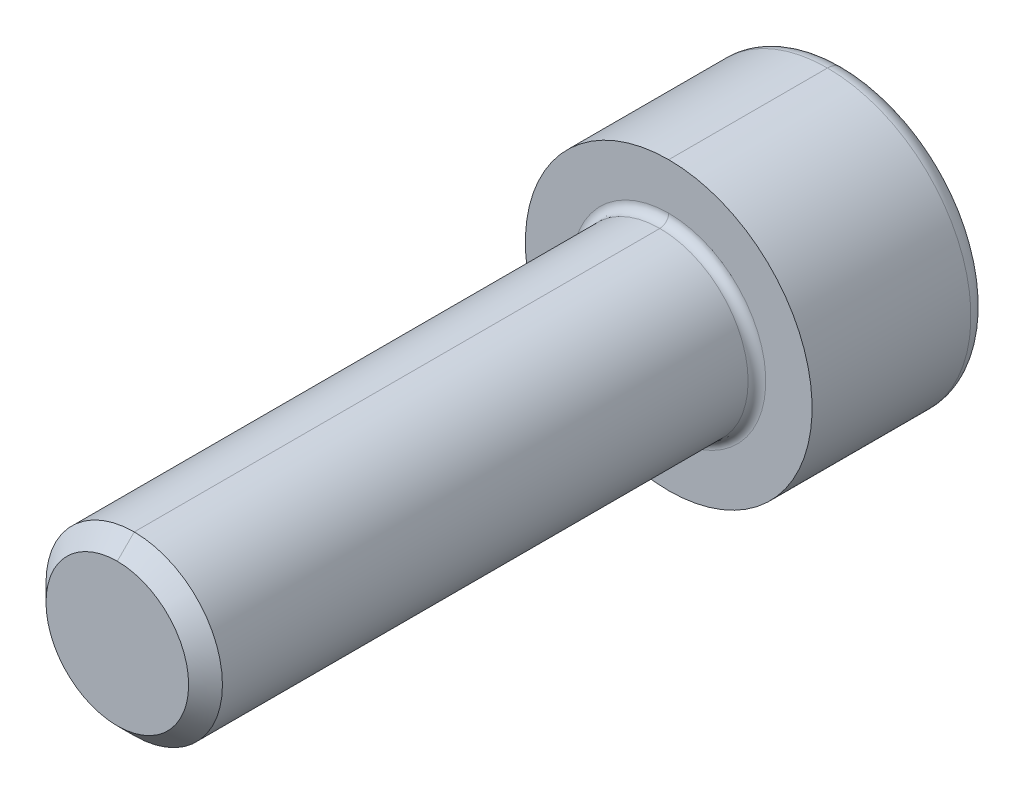
ISO-10303-21;
HEADER;
FILE_DESCRIPTION(('STEP AP214'),'2;1');
FILE_NAME('part.step','',(''),(''),'','','');
FILE_SCHEMA(('AUTOMOTIVE_DESIGN { 1 0 10303 214 1 1 1 1 }'));
ENDSEC;
DATA;
#1=APPLICATION_CONTEXT('core data for automotive mechanical design processes');
#2=APPLICATION_PROTOCOL_DEFINITION('international standard','automotive_design',2000,#1);
#3=PRODUCT_CONTEXT('',#1,'mechanical');
#4=PRODUCT('Part','Part','',(#3));
#5=PRODUCT_RELATED_PRODUCT_CATEGORY('part','',(#4));
#6=PRODUCT_DEFINITION_FORMATION('','',#4);
#7=PRODUCT_DEFINITION_CONTEXT('part definition',#1,'design');
#8=PRODUCT_DEFINITION('design','',#6,#7);
#9=PRODUCT_DEFINITION_SHAPE('','',#8);
#10=(LENGTH_UNIT() NAMED_UNIT(*) SI_UNIT(.MILLI.,.METRE.));
#11=(NAMED_UNIT(*) PLANE_ANGLE_UNIT() SI_UNIT($,.RADIAN.));
#12=(NAMED_UNIT(*) SI_UNIT($,.STERADIAN.) SOLID_ANGLE_UNIT());
#13=UNCERTAINTY_MEASURE_WITH_UNIT(LENGTH_MEASURE(1.E-05),#10,'distance_accuracy_value','');
#14=(GEOMETRIC_REPRESENTATION_CONTEXT(3) GLOBAL_UNCERTAINTY_ASSIGNED_CONTEXT((#13)) GLOBAL_UNIT_ASSIGNED_CONTEXT((#10,
#11,#12)) REPRESENTATION_CONTEXT('',''));
#15=CARTESIAN_POINT('',(0.,0.,0.));
#16=DIRECTION('',(0.,0.,1.));
#17=DIRECTION('',(1.,0.,0.));
#18=AXIS2_PLACEMENT_3D('',#15,#16,#17);
#19=CARTESIAN_POINT('',(1600.,-60.,-1.));
#20=DIRECTION('',(0.,0.,-1.));
#21=DIRECTION('',(0.,-1.,0.));
#22=AXIS2_PLACEMENT_3D('',#19,#20,#21);
#23=PLANE('',#22);
#24=DIRECTION('',(0.,-1.,0.));
#25=VECTOR('',#24,1.);
#26=CARTESIAN_POINT('',(1597.,-59.5669872981,-1.));
#27=LINE('',#26,#25);
#28=CARTESIAN_POINT('',(1597.,-58.2679491924,-1.));
#29=VERTEX_POINT('',#28);
#30=CARTESIAN_POINT('',(1597.,-61.7320508076,-1.));
#31=VERTEX_POINT('',#30);
#32=EDGE_CURVE('E222',#29,#31,#27,.T.);
#33=ORIENTED_EDGE('',*,*,#32,.T.);
#34=DIRECTION('',(0.866025403793048,-0.499999999985088,0.));
#35=VECTOR('',#34,1.);
#36=CARTESIAN_POINT('',(1598.5,-62.5980762113633,-1.));
#37=LINE('',#36,#35);
#38=CARTESIAN_POINT('',(1600.,-63.4641016151,-1.));
#39=VERTEX_POINT('',#38);
#40=EDGE_CURVE('E40',#31,#39,#37,.T.);
#41=ORIENTED_EDGE('',*,*,#40,.T.);
#42=DIRECTION('',(0.866025403793048,0.499999999985088,0.));
#43=VECTOR('',#42,1.);
#44=CARTESIAN_POINT('',(1601.5,-62.5980762113633,-1.));
#45=LINE('',#44,#43);
#46=CARTESIAN_POINT('',(1603.,-61.7320508076,-1.));
#47=VERTEX_POINT('',#46);
#48=EDGE_CURVE('E255',#39,#47,#45,.T.);
#49=ORIENTED_EDGE('',*,*,#48,.T.);
#50=DIRECTION('',(0.,1.,0.));
#51=VECTOR('',#50,1.);
#52=CARTESIAN_POINT('',(1603.,-60.,-1.));
#53=LINE('',#52,#51);
#54=CARTESIAN_POINT('',(1603.,-58.2679491924,-1.));
#55=VERTEX_POINT('',#54);
#56=EDGE_CURVE('E125',#47,#55,#53,.T.);
#57=ORIENTED_EDGE('',*,*,#56,.T.);
#58=DIRECTION('',(-0.866025403793048,0.499999999985088,0.));
#59=VECTOR('',#58,1.);
#60=CARTESIAN_POINT('',(1601.5,-57.4019237886367,-1.));
#61=LINE('',#60,#59);
#62=CARTESIAN_POINT('',(1600.,-56.5358983849,-1.));
#63=VERTEX_POINT('',#62);
#64=EDGE_CURVE('E21',#55,#63,#61,.T.);
#65=ORIENTED_EDGE('',*,*,#64,.T.);
#66=DIRECTION('',(-0.866025403793048,-0.499999999985088,0.));
#67=VECTOR('',#66,1.);
#68=CARTESIAN_POINT('',(1598.5,-57.4019237886367,-1.));
#69=LINE('',#68,#67);
#70=EDGE_CURVE('E197',#63,#29,#69,.T.);
#71=ORIENTED_EDGE('',*,*,#70,.T.);
#72=EDGE_LOOP('',(#33,#41,#49,#57,#65,#71));
#73=FACE_BOUND('',#72,.T.);
#74=CARTESIAN_POINT('',(1600.,-60.,-1.));
#75=DIRECTION('',(0.,0.,-1.));
#76=DIRECTION('',(0.,1.,0.));
#77=AXIS2_PLACEMENT_3D('',#74,#75,#76);
#78=CIRCLE('',#77,5.7);
#79=CARTESIAN_POINT('',(1600.,-54.3,-1.));
#80=VERTEX_POINT('',#79);
#81=CARTESIAN_POINT('',(1600.,-65.7,-1.));
#82=VERTEX_POINT('',#81);
#83=EDGE_CURVE('E27',#80,#82,#78,.T.);
#84=ORIENTED_EDGE('',*,*,#83,.T.);
#85=CARTESIAN_POINT('',(1600.,-60.,-1.));
#86=DIRECTION('',(0.,0.,-1.));
#87=DIRECTION('',(0.,1.,0.));
#88=AXIS2_PLACEMENT_3D('',#85,#86,#87);
#89=CIRCLE('',#88,5.7);
#90=EDGE_CURVE('E189',#82,#80,#89,.T.);
#91=ORIENTED_EDGE('',*,*,#90,.T.);
#92=EDGE_LOOP('',(#84,#91));
#93=FACE_BOUND('',#92,.T.);
#94=ADVANCED_FACE('F17',(#73,#93),#23,.T.);
#95=CARTESIAN_POINT('',(1600.,-60.,7.));
#96=DIRECTION('',(0.,0.,1.));
#97=DIRECTION('',(1.,0.,0.));
#98=AXIS2_PLACEMENT_3D('',#95,#96,#97);
#99=PLANE('',#98);
#100=CARTESIAN_POINT('',(1600.,-60.,7.));
#101=DIRECTION('',(0.,0.,-1.));
#102=DIRECTION('',(0.,1.,0.));
#103=AXIS2_PLACEMENT_3D('',#100,#101,#102);
#104=CIRCLE('',#103,4.4);
#105=CARTESIAN_POINT('',(1600.,-55.6,7.));
#106=VERTEX_POINT('',#105);
#107=CARTESIAN_POINT('',(1600.,-64.4,7.));
#108=VERTEX_POINT('',#107);
#109=EDGE_CURVE('E98',#106,#108,#104,.T.);
#110=ORIENTED_EDGE('',*,*,#109,.T.);
#111=CARTESIAN_POINT('',(1600.,-60.,7.));
#112=DIRECTION('',(0.,0.,-1.));
#113=DIRECTION('',(0.,1.,0.));
#114=AXIS2_PLACEMENT_3D('',#111,#112,#113);
#115=CIRCLE('',#114,4.4);
#116=EDGE_CURVE('E167',#108,#106,#115,.T.);
#117=ORIENTED_EDGE('',*,*,#116,.T.);
#118=EDGE_LOOP('',(#110,#117));
#119=FACE_BOUND('',#118,.T.);
#120=CARTESIAN_POINT('',(1600.,-60.,7.));
#121=DIRECTION('',(0.,0.,1.));
#122=DIRECTION('',(0.,1.,0.));
#123=AXIS2_PLACEMENT_3D('',#120,#121,#122);
#124=CIRCLE('',#123,6.5);
#125=CARTESIAN_POINT('',(1600.,-53.5,7.));
#126=VERTEX_POINT('',#125);
#127=CARTESIAN_POINT('',(1600.,-66.5,7.));
#128=VERTEX_POINT('',#127);
#129=EDGE_CURVE('E11',#126,#128,#124,.T.);
#130=ORIENTED_EDGE('',*,*,#129,.T.);
#131=CARTESIAN_POINT('',(1600.,-60.,7.));
#132=DIRECTION('',(0.,0.,1.));
#133=DIRECTION('',(0.,1.,0.));
#134=AXIS2_PLACEMENT_3D('',#131,#132,#133);
#135=CIRCLE('',#134,6.5);
#136=EDGE_CURVE('E242',#128,#126,#135,.T.);
#137=ORIENTED_EDGE('',*,*,#136,.T.);
#138=EDGE_LOOP('',(#130,#137));
#139=FACE_BOUND('',#138,.T.);
#140=ADVANCED_FACE('F164',(#119,#139),#99,.T.);
#141=CARTESIAN_POINT('',(1600.,-60.,3.));
#142=DIRECTION('',(0.,0.,-1.));
#143=DIRECTION('',(0.,1.,0.));
#144=AXIS2_PLACEMENT_3D('',#141,#142,#143);
#145=CYLINDRICAL_SURFACE('',#144,6.5);
#146=DIRECTION('',(0.,0.,-1.));
#147=VECTOR('',#146,1.);
#148=CARTESIAN_POINT('',(1600.,-53.5,3.));
#149=LINE('',#148,#147);
#150=CARTESIAN_POINT('',(1600.,-53.5,-0.2));
#151=VERTEX_POINT('',#150);
#152=EDGE_CURVE('E243',#126,#151,#149,.T.);
#153=ORIENTED_EDGE('',*,*,#152,.T.);
#154=CARTESIAN_POINT('',(1600.,-60.,-0.2));
#155=DIRECTION('',(0.,0.,1.));
#156=DIRECTION('',(0.,1.,0.));
#157=AXIS2_PLACEMENT_3D('',#154,#155,#156);
#158=CIRCLE('',#157,6.5);
#159=CARTESIAN_POINT('',(1600.,-66.5,-0.2));
#160=VERTEX_POINT('',#159);
#161=EDGE_CURVE('E260',#151,#160,#158,.T.);
#162=ORIENTED_EDGE('',*,*,#161,.T.);
#163=DIRECTION('',(0.,0.,1.));
#164=VECTOR('',#163,1.);
#165=CARTESIAN_POINT('',(1600.,-66.5,3.));
#166=LINE('',#165,#164);
#167=EDGE_CURVE('E237',#160,#128,#166,.T.);
#168=ORIENTED_EDGE('',*,*,#167,.T.);
#169=ORIENTED_EDGE('',*,*,#129,.F.);
#170=EDGE_LOOP('',(#153,#162,#168,#169));
#171=FACE_BOUND('',#170,.T.);
#172=ADVANCED_FACE('F336',(#171),#145,.T.);
#173=CARTESIAN_POINT('',(1600.,-60.,-0.200000000000003));
#174=DIRECTION('',(0.,0.,-1.));
#175=DIRECTION('',(0.,1.,0.));
#176=AXIS2_PLACEMENT_3D('',#173,#174,#175);
#177=TOROIDAL_SURFACE('',#176,5.7,0.8);
#178=CARTESIAN_POINT('',(1600.,-65.7,-0.200000000000003));
#179=DIRECTION('',(1.,0.,0.));
#180=DIRECTION('',(0.,-1.,0.));
#181=AXIS2_PLACEMENT_3D('',#178,#179,#180);
#182=CIRCLE('',#181,0.8);
#183=EDGE_CURVE('E288',#160,#82,#182,.T.);
#184=ORIENTED_EDGE('',*,*,#183,.T.);
#185=ORIENTED_EDGE('',*,*,#83,.F.);
#186=CARTESIAN_POINT('',(1600.,-54.3,-0.200000000000003));
#187=DIRECTION('',(1.,0.,0.));
#188=DIRECTION('',(0.,1.,0.));
#189=AXIS2_PLACEMENT_3D('',#186,#187,#188);
#190=CIRCLE('',#189,0.8);
#191=EDGE_CURVE('E257',#80,#151,#190,.T.);
#192=ORIENTED_EDGE('',*,*,#191,.T.);
#193=CARTESIAN_POINT('',(1600.,-60.,-0.2));
#194=DIRECTION('',(0.,0.,1.));
#195=DIRECTION('',(0.,1.,0.));
#196=AXIS2_PLACEMENT_3D('',#193,#194,#195);
#197=CIRCLE('',#196,6.5);
#198=EDGE_CURVE('E241',#160,#151,#197,.T.);
#199=ORIENTED_EDGE('',*,*,#198,.F.);
#200=EDGE_LOOP('',(#184,#185,#192,#199));
#201=FACE_BOUND('',#200,.T.);
#202=ADVANCED_FACE('F332',(#201),#177,.T.);
#203=CARTESIAN_POINT('',(1600.,-60.,3.));
#204=DIRECTION('',(0.,0.,1.));
#205=DIRECTION('',(1.,0.,0.));
#206=AXIS2_PLACEMENT_3D('',#203,#204,#205);
#207=PLANE('',#206);
#208=DIRECTION('',(0.,1.,0.));
#209=VECTOR('',#208,1.);
#210=CARTESIAN_POINT('',(1597.,-60.,3.));
#211=LINE('',#210,#209);
#212=CARTESIAN_POINT('',(1597.,-61.7320508076,3.));
#213=VERTEX_POINT('',#212);
#214=CARTESIAN_POINT('',(1597.,-58.2679491924,3.));
#215=VERTEX_POINT('',#214);
#216=EDGE_CURVE('E170',#213,#215,#211,.T.);
#217=ORIENTED_EDGE('',*,*,#216,.T.);
#218=DIRECTION('',(0.866025403793048,0.499999999985088,0.));
#219=VECTOR('',#218,1.);
#220=CARTESIAN_POINT('',(1600.,-56.5358983849,3.));
#221=LINE('',#220,#219);
#222=CARTESIAN_POINT('',(1600.,-56.5358983849,3.));
#223=VERTEX_POINT('',#222);
#224=EDGE_CURVE('E200',#215,#223,#221,.T.);
#225=ORIENTED_EDGE('',*,*,#224,.T.);
#226=DIRECTION('',(0.866025403793048,-0.499999999985088,0.));
#227=VECTOR('',#226,1.);
#228=CARTESIAN_POINT('',(1603.,-58.2679491924,3.));
#229=LINE('',#228,#227);
#230=CARTESIAN_POINT('',(1603.,-58.2679491924,3.));
#231=VERTEX_POINT('',#230);
#232=EDGE_CURVE('E207',#223,#231,#229,.T.);
#233=ORIENTED_EDGE('',*,*,#232,.T.);
#234=DIRECTION('',(0.,-1.,0.));
#235=VECTOR('',#234,1.);
#236=CARTESIAN_POINT('',(1603.,-61.7320508076,3.));
#237=LINE('',#236,#235);
#238=CARTESIAN_POINT('',(1603.,-61.7320508076,3.));
#239=VERTEX_POINT('',#238);
#240=EDGE_CURVE('E280',#231,#239,#237,.T.);
#241=ORIENTED_EDGE('',*,*,#240,.T.);
#242=DIRECTION('',(-0.866025403793048,-0.499999999985088,0.));
#243=VECTOR('',#242,1.);
#244=CARTESIAN_POINT('',(1600.,-63.4641016151,3.));
#245=LINE('',#244,#243);
#246=CARTESIAN_POINT('',(1600.,-63.4641016151,3.));
#247=VERTEX_POINT('',#246);
#248=EDGE_CURVE('E136',#239,#247,#245,.T.);
#249=ORIENTED_EDGE('',*,*,#248,.T.);
#250=DIRECTION('',(-0.866025403793048,0.499999999985088,0.));
#251=VECTOR('',#250,1.);
#252=CARTESIAN_POINT('',(1597.,-61.7320508076,3.));
#253=LINE('',#252,#251);
#254=EDGE_CURVE('E52',#247,#213,#253,.T.);
#255=ORIENTED_EDGE('',*,*,#254,.T.);
#256=EDGE_LOOP('',(#217,#225,#233,#241,#249,#255));
#257=FACE_BOUND('',#256,.T.);
#258=ADVANCED_FACE('F310',(#257),#207,.F.);
#259=CARTESIAN_POINT('',(1598.5,-62.59807621135,-1.));
#260=DIRECTION('',(-0.499999999985088,-0.866025403793048,0.));
#261=DIRECTION('',(-0.866025403793048,0.499999999985088,0.));
#262=AXIS2_PLACEMENT_3D('',#259,#260,#261);
#263=PLANE('',#262);
#264=ORIENTED_EDGE('',*,*,#254,.F.);
#265=DIRECTION('',(0.,0.,1.));
#266=VECTOR('',#265,1.);
#267=CARTESIAN_POINT('',(1600.,-63.4641016151,-1.));
#268=LINE('',#267,#266);
#269=EDGE_CURVE('E248',#39,#247,#268,.T.);
#270=ORIENTED_EDGE('',*,*,#269,.F.);
#271=ORIENTED_EDGE('',*,*,#40,.F.);
#272=DIRECTION('',(0.,0.,1.));
#273=VECTOR('',#272,1.);
#274=CARTESIAN_POINT('',(1597.,-61.7320508076,-1.));
#275=LINE('',#274,#273);
#276=EDGE_CURVE('E265',#31,#213,#275,.T.);
#277=ORIENTED_EDGE('',*,*,#276,.T.);
#278=EDGE_LOOP('',(#264,#270,#271,#277));
#279=FACE_BOUND('',#278,.T.);
#280=ADVANCED_FACE('F19',(#279),#263,.F.);
#281=CARTESIAN_POINT('',(1601.5,-62.59807621135,-1.));
#282=DIRECTION('',(0.499999999985088,-0.866025403793048,0.));
#283=DIRECTION('',(0.,0.,-1.));
#284=AXIS2_PLACEMENT_3D('',#281,#282,#283);
#285=PLANE('',#284);
#286=ORIENTED_EDGE('',*,*,#248,.F.);
#287=DIRECTION('',(0.,0.,1.));
#288=VECTOR('',#287,1.);
#289=CARTESIAN_POINT('',(1603.,-61.7320508076,-1.));
#290=LINE('',#289,#288);
#291=EDGE_CURVE('E256',#47,#239,#290,.T.);
#292=ORIENTED_EDGE('',*,*,#291,.F.);
#293=ORIENTED_EDGE('',*,*,#48,.F.);
#294=ORIENTED_EDGE('',*,*,#269,.T.);
#295=EDGE_LOOP('',(#286,#292,#293,#294));
#296=FACE_BOUND('',#295,.T.);
#297=ADVANCED_FACE('F459',(#296),#285,.F.);
#298=CARTESIAN_POINT('',(1603.,-60.,-1.));
#299=DIRECTION('',(1.,0.,0.));
#300=DIRECTION('',(0.,1.,0.));
#301=AXIS2_PLACEMENT_3D('',#298,#299,#300);
#302=PLANE('',#301);
#303=ORIENTED_EDGE('',*,*,#240,.F.);
#304=DIRECTION('',(0.,0.,1.));
#305=VECTOR('',#304,1.);
#306=CARTESIAN_POINT('',(1603.,-58.2679491924,-1.));
#307=LINE('',#306,#305);
#308=EDGE_CURVE('E291',#55,#231,#307,.T.);
#309=ORIENTED_EDGE('',*,*,#308,.F.);
#310=ORIENTED_EDGE('',*,*,#56,.F.);
#311=ORIENTED_EDGE('',*,*,#291,.T.);
#312=EDGE_LOOP('',(#303,#309,#310,#311));
#313=FACE_BOUND('',#312,.T.);
#314=ADVANCED_FACE('F312',(#313),#302,.F.);
#315=CARTESIAN_POINT('',(1601.5,-57.40192378865,-1.));
#316=DIRECTION('',(0.499999999985088,0.866025403793048,0.));
#317=DIRECTION('',(0.,0.,-1.));
#318=AXIS2_PLACEMENT_3D('',#315,#316,#317);
#319=PLANE('',#318);
#320=ORIENTED_EDGE('',*,*,#232,.F.);
#321=DIRECTION('',(0.,0.,1.));
#322=VECTOR('',#321,1.);
#323=CARTESIAN_POINT('',(1600.,-56.5358983849,-1.));
#324=LINE('',#323,#322);
#325=EDGE_CURVE('E199',#63,#223,#324,.T.);
#326=ORIENTED_EDGE('',*,*,#325,.F.);
#327=ORIENTED_EDGE('',*,*,#64,.F.);
#328=ORIENTED_EDGE('',*,*,#308,.T.);
#329=EDGE_LOOP('',(#320,#326,#327,#328));
#330=FACE_BOUND('',#329,.T.);
#331=ADVANCED_FACE('F315',(#330),#319,.F.);
#332=CARTESIAN_POINT('',(1598.5,-57.40192378865,-1.));
#333=DIRECTION('',(-0.499999999985088,0.866025403793048,0.));
#334=DIRECTION('',(0.,0.,1.));
#335=AXIS2_PLACEMENT_3D('',#332,#333,#334);
#336=PLANE('',#335);
#337=ORIENTED_EDGE('',*,*,#224,.F.);
#338=DIRECTION('',(0.,0.,1.));
#339=VECTOR('',#338,1.);
#340=CARTESIAN_POINT('',(1597.,-58.2679491924,-1.));
#341=LINE('',#340,#339);
#342=EDGE_CURVE('E211',#29,#215,#341,.T.);
#343=ORIENTED_EDGE('',*,*,#342,.F.);
#344=ORIENTED_EDGE('',*,*,#70,.F.);
#345=ORIENTED_EDGE('',*,*,#325,.T.);
#346=EDGE_LOOP('',(#337,#343,#344,#345));
#347=FACE_BOUND('',#346,.T.);
#348=ADVANCED_FACE('F410',(#347),#336,.F.);
#349=CARTESIAN_POINT('',(1597.,-59.1339745962,-1.));
#350=DIRECTION('',(-1.,0.,0.));
#351=DIRECTION('',(0.,0.,1.));
#352=AXIS2_PLACEMENT_3D('',#349,#350,#351);
#353=PLANE('',#352);
#354=ORIENTED_EDGE('',*,*,#216,.F.);
#355=ORIENTED_EDGE('',*,*,#276,.F.);
#356=ORIENTED_EDGE('',*,*,#32,.F.);
#357=ORIENTED_EDGE('',*,*,#342,.T.);
#358=EDGE_LOOP('',(#354,#355,#356,#357));
#359=FACE_BOUND('',#358,.T.);
#360=ADVANCED_FACE('F326',(#359),#353,.F.);
#361=CARTESIAN_POINT('',(1600.,-60.,7.4));
#362=DIRECTION('',(0.,0.,1.));
#363=DIRECTION('',(0.,1.,0.));
#364=AXIS2_PLACEMENT_3D('',#361,#362,#363);
#365=TOROIDAL_SURFACE('',#364,4.4,0.4);
#366=CARTESIAN_POINT('',(1600.,-55.6,7.4));
#367=DIRECTION('',(-1.,0.,0.));
#368=DIRECTION('',(0.,1.,0.));
#369=AXIS2_PLACEMENT_3D('',#366,#367,#368);
#370=CIRCLE('',#369,0.4);
#371=CARTESIAN_POINT('',(1600.,-56.,7.4));
#372=VERTEX_POINT('',#371);
#373=EDGE_CURVE('E182',#106,#372,#370,.T.);
#374=ORIENTED_EDGE('',*,*,#373,.T.);
#375=CARTESIAN_POINT('',(1600.,-60.,7.4));
#376=DIRECTION('',(0.,0.,1.));
#377=DIRECTION('',(1.,0.,0.));
#378=AXIS2_PLACEMENT_3D('',#375,#376,#377);
#379=CIRCLE('',#378,4.);
#380=CARTESIAN_POINT('',(1600.,-64.,7.4));
#381=VERTEX_POINT('',#380);
#382=EDGE_CURVE('E160',#381,#372,#379,.T.);
#383=ORIENTED_EDGE('',*,*,#382,.F.);
#384=CARTESIAN_POINT('',(1600.,-64.4,7.4));
#385=DIRECTION('',(-1.,0.,0.));
#386=DIRECTION('',(0.,-1.,0.));
#387=AXIS2_PLACEMENT_3D('',#384,#385,#386);
#388=CIRCLE('',#387,0.4);
#389=EDGE_CURVE('E173',#381,#108,#388,.T.);
#390=ORIENTED_EDGE('',*,*,#389,.T.);
#391=ORIENTED_EDGE('',*,*,#109,.F.);
#392=EDGE_LOOP('',(#374,#383,#390,#391));
#393=FACE_BOUND('',#392,.T.);
#394=ADVANCED_FACE('F174',(#393),#365,.F.);
#395=CARTESIAN_POINT('',(1600.,-60.,32.));
#396=DIRECTION('',(0.,0.,1.));
#397=DIRECTION('',(1.,0.,0.));
#398=AXIS2_PLACEMENT_3D('',#395,#396,#397);
#399=PLANE('',#398);
#400=CARTESIAN_POINT('',(1600.,-60.,32.));
#401=DIRECTION('',(0.,0.,1.));
#402=DIRECTION('',(0.,1.,0.));
#403=AXIS2_PLACEMENT_3D('',#400,#401,#402);
#404=CIRCLE('',#403,3.2332);
#405=CARTESIAN_POINT('',(1600.,-56.7668,32.));
#406=VERTEX_POINT('',#405);
#407=CARTESIAN_POINT('',(1600.,-63.2332,32.));
#408=VERTEX_POINT('',#407);
#409=EDGE_CURVE('E236',#406,#408,#404,.T.);
#410=ORIENTED_EDGE('',*,*,#409,.T.);
#411=CARTESIAN_POINT('',(1600.,-60.,32.));
#412=DIRECTION('',(0.,0.,1.));
#413=DIRECTION('',(0.,1.,0.));
#414=AXIS2_PLACEMENT_3D('',#411,#412,#413);
#415=CIRCLE('',#414,3.2332);
#416=EDGE_CURVE('E196',#408,#406,#415,.T.);
#417=ORIENTED_EDGE('',*,*,#416,.T.);
#418=EDGE_LOOP('',(#410,#417));
#419=FACE_BOUND('',#418,.T.);
#420=ADVANCED_FACE('F325',(#419),#399,.T.);
#421=CARTESIAN_POINT('',(1600.,-60.,19.5));
#422=DIRECTION('',(0.,0.,1.));
#423=DIRECTION('',(0.,1.,0.));
#424=AXIS2_PLACEMENT_3D('',#421,#422,#423);
#425=CYLINDRICAL_SURFACE('',#424,4.);
#426=DIRECTION('',(0.,0.,1.));
#427=VECTOR('',#426,1.);
#428=CARTESIAN_POINT('',(1600.,-56.,19.5));
#429=LINE('',#428,#427);
#430=CARTESIAN_POINT('',(1600.,-56.,31.2332));
#431=VERTEX_POINT('',#430);
#432=EDGE_CURVE('E271',#372,#431,#429,.T.);
#433=ORIENTED_EDGE('',*,*,#432,.T.);
#434=CARTESIAN_POINT('',(1600.,-60.,31.2332));
#435=DIRECTION('',(0.,0.,-1.));
#436=DIRECTION('',(0.,1.,0.));
#437=AXIS2_PLACEMENT_3D('',#434,#435,#436);
#438=CIRCLE('',#437,4.);
#439=CARTESIAN_POINT('',(1600.,-64.,31.2332));
#440=VERTEX_POINT('',#439);
#441=EDGE_CURVE('E195',#431,#440,#438,.T.);
#442=ORIENTED_EDGE('',*,*,#441,.T.);
#443=DIRECTION('',(0.,0.,-1.));
#444=VECTOR('',#443,1.);
#445=CARTESIAN_POINT('',(1600.,-64.,19.5));
#446=LINE('',#445,#444);
#447=EDGE_CURVE('E233',#440,#381,#446,.T.);
#448=ORIENTED_EDGE('',*,*,#447,.T.);
#449=ORIENTED_EDGE('',*,*,#382,.T.);
#450=EDGE_LOOP('',(#433,#442,#448,#449));
#451=FACE_BOUND('',#450,.T.);
#452=ADVANCED_FACE('F344',(#451),#425,.T.);
#453=CARTESIAN_POINT('',(1600.,-60.,31.6166));
#454=DIRECTION('',(0.,0.,-1.));
#455=DIRECTION('',(0.,1.,0.));
#456=AXIS2_PLACEMENT_3D('',#453,#454,#455);
#457=CONICAL_SURFACE('',#456,3.6166,0.785398163397448);
#458=DIRECTION('',(0.,-0.707106781186547,0.707106781186548));
#459=VECTOR('',#458,1.);
#460=CARTESIAN_POINT('',(1600.,-56.3834,31.6166));
#461=LINE('',#460,#459);
#462=EDGE_CURVE('E232',#431,#406,#461,.T.);
#463=ORIENTED_EDGE('',*,*,#462,.T.);
#464=ORIENTED_EDGE('',*,*,#416,.F.);
#465=DIRECTION('',(0.,-0.707106781186547,-0.707106781186548));
#466=VECTOR('',#465,1.);
#467=CARTESIAN_POINT('',(1600.,-63.6166,31.6166));
#468=LINE('',#467,#466);
#469=EDGE_CURVE('E193',#408,#440,#468,.T.);
#470=ORIENTED_EDGE('',*,*,#469,.T.);
#471=ORIENTED_EDGE('',*,*,#441,.F.);
#472=EDGE_LOOP('',(#463,#464,#470,#471));
#473=FACE_BOUND('',#472,.T.);
#474=ADVANCED_FACE('F358',(#473),#457,.T.);
#475=CARTESIAN_POINT('',(1600.,-60.,31.6166));
#476=DIRECTION('',(0.,0.,-1.));
#477=DIRECTION('',(0.,1.,0.));
#478=AXIS2_PLACEMENT_3D('',#475,#476,#477);
#479=CONICAL_SURFACE('',#478,3.6166,0.785398163397448);
#480=ORIENTED_EDGE('',*,*,#462,.F.);
#481=CARTESIAN_POINT('',(1600.,-60.,31.2332));
#482=DIRECTION('',(0.,0.,-1.));
#483=DIRECTION('',(0.,1.,0.));
#484=AXIS2_PLACEMENT_3D('',#481,#482,#483);
#485=CIRCLE('',#484,4.);
#486=EDGE_CURVE('E228',#440,#431,#485,.T.);
#487=ORIENTED_EDGE('',*,*,#486,.F.);
#488=ORIENTED_EDGE('',*,*,#469,.F.);
#489=ORIENTED_EDGE('',*,*,#409,.F.);
#490=EDGE_LOOP('',(#480,#487,#488,#489));
#491=FACE_BOUND('',#490,.T.);
#492=ADVANCED_FACE('F362',(#491),#479,.T.);
#493=CARTESIAN_POINT('',(1600.,-60.,19.5));
#494=DIRECTION('',(0.,0.,1.));
#495=DIRECTION('',(0.,1.,0.));
#496=AXIS2_PLACEMENT_3D('',#493,#494,#495);
#497=CYLINDRICAL_SURFACE('',#496,4.);
#498=ORIENTED_EDGE('',*,*,#432,.F.);
#499=CARTESIAN_POINT('',(1600.,-60.,7.4));
#500=DIRECTION('',(0.,0.,1.));
#501=DIRECTION('',(1.,0.,0.));
#502=AXIS2_PLACEMENT_3D('',#499,#500,#501);
#503=CIRCLE('',#502,4.);
#504=CARTESIAN_POINT('',(1596.,-60.,7.4));
#505=VERTEX_POINT('',#504);
#506=EDGE_CURVE('E275',#372,#505,#503,.T.);
#507=ORIENTED_EDGE('',*,*,#506,.T.);
#508=CARTESIAN_POINT('',(1600.,-60.,7.4));
#509=DIRECTION('',(0.,0.,1.));
#510=DIRECTION('',(1.,0.,0.));
#511=AXIS2_PLACEMENT_3D('',#508,#509,#510);
#512=CIRCLE('',#511,4.);
#513=EDGE_CURVE('E178',#505,#381,#512,.T.);
#514=ORIENTED_EDGE('',*,*,#513,.T.);
#515=ORIENTED_EDGE('',*,*,#447,.F.);
#516=ORIENTED_EDGE('',*,*,#486,.T.);
#517=EDGE_LOOP('',(#498,#507,#514,#515,#516));
#518=FACE_BOUND('',#517,.T.);
#519=ADVANCED_FACE('F372',(#518),#497,.T.);
#520=CARTESIAN_POINT('',(1600.,-60.,7.4));
#521=DIRECTION('',(0.,0.,1.));
#522=DIRECTION('',(0.,1.,0.));
#523=AXIS2_PLACEMENT_3D('',#520,#521,#522);
#524=TOROIDAL_SURFACE('',#523,4.4,0.4);
#525=ORIENTED_EDGE('',*,*,#373,.F.);
#526=ORIENTED_EDGE('',*,*,#116,.F.);
#527=ORIENTED_EDGE('',*,*,#389,.F.);
#528=ORIENTED_EDGE('',*,*,#513,.F.);
#529=ORIENTED_EDGE('',*,*,#506,.F.);
#530=EDGE_LOOP('',(#525,#526,#527,#528,#529));
#531=FACE_BOUND('',#530,.T.);
#532=ADVANCED_FACE('F180',(#531),#524,.F.);
#533=CARTESIAN_POINT('',(1600.,-60.,-0.200000000000003));
#534=DIRECTION('',(0.,0.,-1.));
#535=DIRECTION('',(0.,1.,0.));
#536=AXIS2_PLACEMENT_3D('',#533,#534,#535);
#537=TOROIDAL_SURFACE('',#536,5.7,0.8);
#538=ORIENTED_EDGE('',*,*,#183,.F.);
#539=ORIENTED_EDGE('',*,*,#161,.F.);
#540=ORIENTED_EDGE('',*,*,#191,.F.);
#541=ORIENTED_EDGE('',*,*,#90,.F.);
#542=EDGE_LOOP('',(#538,#539,#540,#541));
#543=FACE_BOUND('',#542,.T.);
#544=ADVANCED_FACE('F371',(#543),#537,.T.);
#545=CARTESIAN_POINT('',(1600.,-60.,3.));
#546=DIRECTION('',(0.,0.,-1.));
#547=DIRECTION('',(0.,1.,0.));
#548=AXIS2_PLACEMENT_3D('',#545,#546,#547);
#549=CYLINDRICAL_SURFACE('',#548,6.5);
#550=ORIENTED_EDGE('',*,*,#152,.F.);
#551=ORIENTED_EDGE('',*,*,#136,.F.);
#552=ORIENTED_EDGE('',*,*,#167,.F.);
#553=ORIENTED_EDGE('',*,*,#198,.T.);
#554=EDGE_LOOP('',(#550,#551,#552,#553));
#555=FACE_BOUND('',#554,.T.);
#556=ADVANCED_FACE('F377',(#555),#549,.T.);
#557=CLOSED_SHELL('',(#94,#140,#172,#202,#258,#280,#297,#314,#331,#348,#360,#394,#420,#452,#474,
#492,#519,#532,#544,#556));
#558=MANIFOLD_SOLID_BREP('B1',#557);
#559=ADVANCED_BREP_SHAPE_REPRESENTATION('',(#18,#558),#14);
#560=SHAPE_DEFINITION_REPRESENTATION(#9,#559);
ENDSEC;
END-ISO-10303-21;
